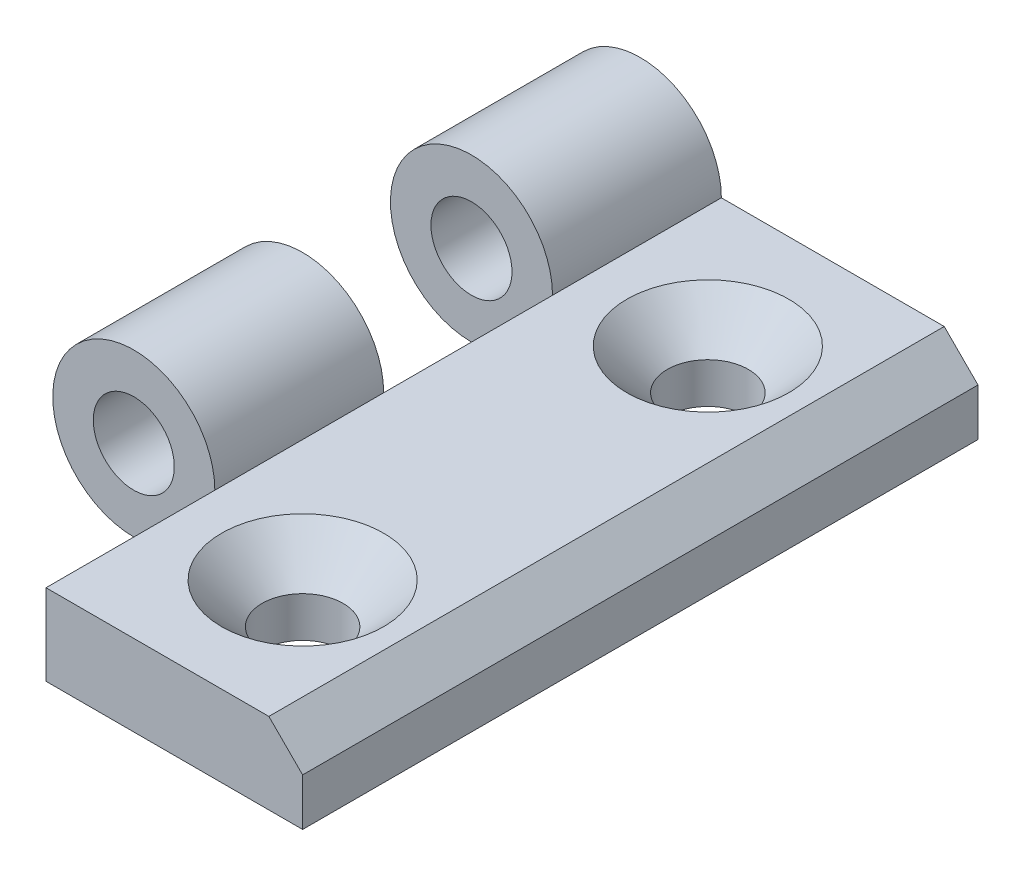
ISO-10303-21;
HEADER;
FILE_DESCRIPTION(('STEP AP214'),'2;1');
FILE_NAME('part.step','',(''),(''),'','','');
FILE_SCHEMA(('AUTOMOTIVE_DESIGN { 1 0 10303 214 1 1 1 1 }'));
ENDSEC;
DATA;
#1=APPLICATION_CONTEXT('core data for automotive mechanical design processes');
#2=APPLICATION_PROTOCOL_DEFINITION('international standard','automotive_design',2000,#1);
#3=PRODUCT_CONTEXT('',#1,'mechanical');
#4=PRODUCT('Part','Part','',(#3));
#5=PRODUCT_RELATED_PRODUCT_CATEGORY('part','',(#4));
#6=PRODUCT_DEFINITION_FORMATION('','',#4);
#7=PRODUCT_DEFINITION_CONTEXT('part definition',#1,'design');
#8=PRODUCT_DEFINITION('design','',#6,#7);
#9=PRODUCT_DEFINITION_SHAPE('','',#8);
#10=(LENGTH_UNIT() NAMED_UNIT(*) SI_UNIT(.MILLI.,.METRE.));
#11=(NAMED_UNIT(*) PLANE_ANGLE_UNIT() SI_UNIT($,.RADIAN.));
#12=(NAMED_UNIT(*) SI_UNIT($,.STERADIAN.) SOLID_ANGLE_UNIT());
#13=UNCERTAINTY_MEASURE_WITH_UNIT(LENGTH_MEASURE(1.E-05),#10,'distance_accuracy_value','');
#14=(GEOMETRIC_REPRESENTATION_CONTEXT(3) GLOBAL_UNCERTAINTY_ASSIGNED_CONTEXT((#13)) GLOBAL_UNIT_ASSIGNED_CONTEXT((#10,
#11,#12)) REPRESENTATION_CONTEXT('',''));
#15=CARTESIAN_POINT('',(0.,0.,0.));
#16=DIRECTION('',(0.,0.,1.));
#17=DIRECTION('',(1.,0.,0.));
#18=AXIS2_PLACEMENT_3D('',#15,#16,#17);
#19=CARTESIAN_POINT('',(-36.9996963445374,47.3325537523692,50.));
#20=DIRECTION('',(0.,0.,-1.));
#21=DIRECTION('',(-1.,0.,0.));
#22=AXIS2_PLACEMENT_3D('',#19,#20,#21);
#23=CYLINDRICAL_SURFACE('',#22,6.);
#24=CARTESIAN_POINT('',(-36.9996963445374,47.3325537523692,25.));
#25=DIRECTION('',(0.,0.,-1.));
#26=DIRECTION('',(-1.,0.,0.));
#27=AXIS2_PLACEMENT_3D('',#24,#25,#26);
#28=CIRCLE('',#27,6.);
#29=CARTESIAN_POINT('',(-36.9996963445374,41.3325537523692,25.));
#30=VERTEX_POINT('',#29);
#31=CARTESIAN_POINT('',(-30.9996963445374,47.3325537523692,25.));
#32=VERTEX_POINT('',#31);
#33=EDGE_CURVE('E108',#30,#32,#28,.T.);
#34=ORIENTED_EDGE('',*,*,#33,.F.);
#35=DIRECTION('',(0.,0.,1.));
#36=VECTOR('',#35,1.);
#37=CARTESIAN_POINT('',(-36.9996963445374,41.3325537523692,0.));
#38=LINE('',#37,#36);
#39=CARTESIAN_POINT('',(-36.9996963445374,41.3325537523692,37.5));
#40=VERTEX_POINT('',#39);
#41=EDGE_CURVE('E195',#30,#40,#38,.T.);
#42=ORIENTED_EDGE('',*,*,#41,.T.);
#43=CARTESIAN_POINT('',(-36.9996963445374,47.3325537523692,37.5));
#44=DIRECTION('',(0.,0.,-1.));
#45=DIRECTION('',(-1.,0.,0.));
#46=AXIS2_PLACEMENT_3D('',#43,#44,#45);
#47=CIRCLE('',#46,6.);
#48=CARTESIAN_POINT('',(-30.9996963445374,47.3325537523692,37.5));
#49=VERTEX_POINT('',#48);
#50=EDGE_CURVE('E142',#40,#49,#47,.T.);
#51=ORIENTED_EDGE('',*,*,#50,.T.);
#52=DIRECTION('',(0.,0.,-1.));
#53=VECTOR('',#52,1.);
#54=CARTESIAN_POINT('',(-30.9996963445374,47.3325537523692,50.));
#55=LINE('',#54,#53);
#56=EDGE_CURVE('E134',#49,#32,#55,.T.);
#57=ORIENTED_EDGE('',*,*,#56,.T.);
#58=EDGE_LOOP('',(#34,#42,#51,#57));
#59=FACE_BOUND('',#58,.T.);
#60=ADVANCED_FACE('F37',(#59),#23,.T.);
#61=CARTESIAN_POINT('',(-36.9996963445374,47.3325537523692,0.));
#62=DIRECTION('',(0.,0.,1.));
#63=DIRECTION('',(1.,0.,0.));
#64=AXIS2_PLACEMENT_3D('',#61,#62,#63);
#65=CYLINDRICAL_SURFACE('',#64,3.);
#66=CARTESIAN_POINT('',(-36.9996963445374,47.3325537523692,37.5));
#67=DIRECTION('',(0.,0.,-1.));
#68=DIRECTION('',(-1.,0.,0.));
#69=AXIS2_PLACEMENT_3D('',#66,#67,#68);
#70=CIRCLE('',#69,3.);
#71=CARTESIAN_POINT('',(-39.9996963445374,47.3325537523692,37.5));
#72=VERTEX_POINT('',#71);
#73=EDGE_CURVE('E154',#72,#72,#70,.F.);
#74=ORIENTED_EDGE('',*,*,#73,.T.);
#75=EDGE_LOOP('',(#74));
#76=FACE_BOUND('',#75,.T.);
#77=CARTESIAN_POINT('',(-36.9996963445374,47.3325537523692,25.));
#78=DIRECTION('',(0.,0.,-1.));
#79=DIRECTION('',(-1.,0.,0.));
#80=AXIS2_PLACEMENT_3D('',#77,#78,#79);
#81=CIRCLE('',#80,3.);
#82=CARTESIAN_POINT('',(-39.9996963445374,47.3325537523692,25.));
#83=VERTEX_POINT('',#82);
#84=EDGE_CURVE('E160',#83,#83,#81,.F.);
#85=ORIENTED_EDGE('',*,*,#84,.F.);
#86=EDGE_LOOP('',(#85));
#87=FACE_BOUND('',#86,.T.);
#88=ADVANCED_FACE('F256',(#76,#87),#65,.F.);
#89=CARTESIAN_POINT('',(-36.9996963445374,41.3325537523692,0.));
#90=VERTEX_POINT('',#89);
#91=CARTESIAN_POINT('',(-36.9996963445374,41.3325537523692,12.5));
#92=VERTEX_POINT('',#91);
#93=EDGE_CURVE('E149',#90,#92,#38,.T.);
#94=ORIENTED_EDGE('',*,*,#93,.T.);
#95=CARTESIAN_POINT('',(-36.9996963445374,47.3325537523692,12.5));
#96=DIRECTION('',(0.,0.,-1.));
#97=DIRECTION('',(-1.,0.,0.));
#98=AXIS2_PLACEMENT_3D('',#95,#96,#97);
#99=CIRCLE('',#98,6.);
#100=CARTESIAN_POINT('',(-30.9996963445374,47.3325537523692,12.5));
#101=VERTEX_POINT('',#100);
#102=EDGE_CURVE('E138',#92,#101,#99,.T.);
#103=ORIENTED_EDGE('',*,*,#102,.T.);
#104=CARTESIAN_POINT('',(-30.9996963445374,47.3325537523692,0.));
#105=VERTEX_POINT('',#104);
#106=EDGE_CURVE('E136',#101,#105,#55,.T.);
#107=ORIENTED_EDGE('',*,*,#106,.T.);
#108=CARTESIAN_POINT('',(-36.9996963445374,47.3325537523692,0.));
#109=DIRECTION('',(0.,0.,1.));
#110=DIRECTION('',(1.,0.,0.));
#111=AXIS2_PLACEMENT_3D('',#108,#109,#110);
#112=CIRCLE('',#111,6.);
#113=EDGE_CURVE('E145',#105,#90,#112,.T.);
#114=ORIENTED_EDGE('',*,*,#113,.T.);
#115=EDGE_LOOP('',(#94,#103,#107,#114));
#116=FACE_BOUND('',#115,.T.);
#117=ADVANCED_FACE('F236',(#116),#23,.T.);
#118=CARTESIAN_POINT('',(-36.9996963445374,47.3325537523692,50.));
#119=DIRECTION('',(0.,0.,1.));
#120=DIRECTION('',(1.,0.,0.));
#121=AXIS2_PLACEMENT_3D('',#118,#119,#120);
#122=PLANE('',#121);
#123=DIRECTION('',(0.,1.,0.));
#124=VECTOR('',#123,1.);
#125=CARTESIAN_POINT('',(-11.9996963445374,47.3325537523692,50.));
#126=LINE('',#125,#124);
#127=CARTESIAN_POINT('',(-11.9996963445374,41.3325537523692,50.));
#128=VERTEX_POINT('',#127);
#129=CARTESIAN_POINT('',(-11.9996963445374,44.8325537523692,50.));
#130=VERTEX_POINT('',#129);
#131=EDGE_CURVE('E175',#128,#130,#126,.T.);
#132=ORIENTED_EDGE('',*,*,#131,.T.);
#133=DIRECTION('',(0.707106781186549,-0.707106781186546,0.));
#134=VECTOR('',#133,1.);
#135=CARTESIAN_POINT('',(-25.7496963445374,58.5825537523692,50.));
#136=LINE('',#135,#134);
#137=CARTESIAN_POINT('',(-14.4996963445374,47.3325537523692,50.));
#138=VERTEX_POINT('',#137);
#139=EDGE_CURVE('E59',#130,#138,#136,.F.);
#140=ORIENTED_EDGE('',*,*,#139,.T.);
#141=DIRECTION('',(-1.,0.,0.));
#142=VECTOR('',#141,1.);
#143=CARTESIAN_POINT('',(-36.9996963445374,47.3325537523692,50.));
#144=LINE('',#143,#142);
#145=CARTESIAN_POINT('',(-30.9996963445374,47.3325537523692,50.));
#146=VERTEX_POINT('',#145);
#147=EDGE_CURVE('E189',#138,#146,#144,.T.);
#148=ORIENTED_EDGE('',*,*,#147,.T.);
#149=DIRECTION('',(0.,1.,0.));
#150=VECTOR('',#149,1.);
#151=CARTESIAN_POINT('',(-30.9996963445374,47.3325537523692,50.));
#152=LINE('',#151,#150);
#153=CARTESIAN_POINT('',(-30.9996963445374,41.3325537523692,50.));
#154=VERTEX_POINT('',#153);
#155=EDGE_CURVE('E137',#154,#146,#152,.T.);
#156=ORIENTED_EDGE('',*,*,#155,.F.);
#157=DIRECTION('',(1.,0.,0.));
#158=VECTOR('',#157,1.);
#159=CARTESIAN_POINT('',(-36.9996963445374,41.3325537523692,50.));
#160=LINE('',#159,#158);
#161=EDGE_CURVE('E183',#154,#128,#160,.T.);
#162=ORIENTED_EDGE('',*,*,#161,.T.);
#163=EDGE_LOOP('',(#132,#140,#148,#156,#162));
#164=FACE_BOUND('',#163,.T.);
#165=ADVANCED_FACE('F180',(#164),#122,.T.);
#166=CARTESIAN_POINT('',(-36.9996963445374,47.3325537523692,0.));
#167=DIRECTION('',(0.,0.,1.));
#168=DIRECTION('',(1.,0.,0.));
#169=AXIS2_PLACEMENT_3D('',#166,#167,#168);
#170=PLANE('',#169);
#171=CARTESIAN_POINT('',(-36.9996963445374,47.3325537523692,0.));
#172=DIRECTION('',(0.,0.,1.));
#173=DIRECTION('',(1.,0.,0.));
#174=AXIS2_PLACEMENT_3D('',#171,#172,#173);
#175=CIRCLE('',#174,3.);
#176=CARTESIAN_POINT('',(-33.9996963445374,47.3325537523692,0.));
#177=VERTEX_POINT('',#176);
#178=EDGE_CURVE('E200',#177,#177,#175,.T.);
#179=ORIENTED_EDGE('',*,*,#178,.T.);
#180=EDGE_LOOP('',(#179));
#181=FACE_BOUND('',#180,.T.);
#182=DIRECTION('',(-1.,0.,0.));
#183=VECTOR('',#182,1.);
#184=CARTESIAN_POINT('',(-36.9996963445374,47.3325537523692,0.));
#185=LINE('',#184,#183);
#186=CARTESIAN_POINT('',(-14.4996963445374,47.3325537523692,0.));
#187=VERTEX_POINT('',#186);
#188=EDGE_CURVE('E185',#187,#105,#185,.T.);
#189=ORIENTED_EDGE('',*,*,#188,.F.);
#190=DIRECTION('',(-0.707106781186549,0.707106781186546,0.));
#191=VECTOR('',#190,1.);
#192=CARTESIAN_POINT('',(-11.9996963445374,44.8325537523692,0.));
#193=LINE('',#192,#191);
#194=CARTESIAN_POINT('',(-11.9996963445374,44.8325537523692,0.));
#195=VERTEX_POINT('',#194);
#196=EDGE_CURVE('E11',#187,#195,#193,.F.);
#197=ORIENTED_EDGE('',*,*,#196,.T.);
#198=DIRECTION('',(0.,1.,0.));
#199=VECTOR('',#198,1.);
#200=CARTESIAN_POINT('',(-11.9996963445374,47.3325537523692,0.));
#201=LINE('',#200,#199);
#202=CARTESIAN_POINT('',(-11.9996963445374,41.3325537523692,0.));
#203=VERTEX_POINT('',#202);
#204=EDGE_CURVE('E177',#203,#195,#201,.T.);
#205=ORIENTED_EDGE('',*,*,#204,.F.);
#206=DIRECTION('',(1.,0.,0.));
#207=VECTOR('',#206,1.);
#208=CARTESIAN_POINT('',(-36.9996963445374,41.3325537523692,0.));
#209=LINE('',#208,#207);
#210=EDGE_CURVE('E187',#90,#203,#209,.T.);
#211=ORIENTED_EDGE('',*,*,#210,.F.);
#212=ORIENTED_EDGE('',*,*,#113,.F.);
#213=EDGE_LOOP('',(#189,#197,#205,#211,#212));
#214=FACE_BOUND('',#213,.T.);
#215=ADVANCED_FACE('F240',(#181,#214),#170,.F.);
#216=CARTESIAN_POINT('',(-36.9996963445374,47.3325537523692,0.));
#217=DIRECTION('',(0.,1.,0.));
#218=DIRECTION('',(0.,0.,1.));
#219=AXIS2_PLACEMENT_3D('',#216,#217,#218);
#220=PLANE('',#219);
#221=CARTESIAN_POINT('',(-21.9996963445374,47.3325537523692,40.));
#222=DIRECTION('',(0.,1.,0.));
#223=DIRECTION('',(0.,0.,1.));
#224=AXIS2_PLACEMENT_3D('',#221,#222,#223);
#225=CIRCLE('',#224,6.);
#226=CARTESIAN_POINT('',(-21.9996963445374,47.3325537523692,46.));
#227=VERTEX_POINT('',#226);
#228=EDGE_CURVE('E222',#227,#227,#225,.T.);
#229=ORIENTED_EDGE('',*,*,#228,.F.);
#230=EDGE_LOOP('',(#229));
#231=FACE_BOUND('',#230,.T.);
#232=CARTESIAN_POINT('',(-21.9996963445374,47.3325537523692,10.));
#233=DIRECTION('',(0.,1.,0.));
#234=DIRECTION('',(0.,0.,1.));
#235=AXIS2_PLACEMENT_3D('',#232,#233,#234);
#236=CIRCLE('',#235,6.);
#237=CARTESIAN_POINT('',(-21.9996963445374,47.3325537523692,16.));
#238=VERTEX_POINT('',#237);
#239=EDGE_CURVE('E213',#238,#238,#236,.T.);
#240=ORIENTED_EDGE('',*,*,#239,.F.);
#241=EDGE_LOOP('',(#240));
#242=FACE_BOUND('',#241,.T.);
#243=ORIENTED_EDGE('',*,*,#147,.F.);
#244=DIRECTION('',(0.,0.,-1.));
#245=VECTOR('',#244,1.);
#246=CARTESIAN_POINT('',(-14.4996963445374,47.3325537523692,0.));
#247=LINE('',#246,#245);
#248=EDGE_CURVE('E45',#138,#187,#247,.T.);
#249=ORIENTED_EDGE('',*,*,#248,.T.);
#250=ORIENTED_EDGE('',*,*,#188,.T.);
#251=ORIENTED_EDGE('',*,*,#106,.F.);
#252=DIRECTION('',(0.,0.,-1.));
#253=VECTOR('',#252,1.);
#254=CARTESIAN_POINT('',(-30.9996963445374,47.3325537523692,0.));
#255=LINE('',#254,#253);
#256=EDGE_CURVE('E124',#32,#101,#255,.T.);
#257=ORIENTED_EDGE('',*,*,#256,.F.);
#258=ORIENTED_EDGE('',*,*,#56,.F.);
#259=EDGE_CURVE('E143',#146,#49,#55,.T.);
#260=ORIENTED_EDGE('',*,*,#259,.F.);
#261=EDGE_LOOP('',(#243,#249,#250,#251,#257,#258,#260));
#262=FACE_BOUND('',#261,.T.);
#263=ADVANCED_FACE('F132',(#231,#242,#262),#220,.T.);
#264=CARTESIAN_POINT('',(-11.9996963445374,47.3325537523692,0.));
#265=DIRECTION('',(1.,0.,0.));
#266=DIRECTION('',(0.,0.,-1.));
#267=AXIS2_PLACEMENT_3D('',#264,#265,#266);
#268=PLANE('',#267);
#269=ORIENTED_EDGE('',*,*,#204,.T.);
#270=DIRECTION('',(0.,0.,1.));
#271=VECTOR('',#270,1.);
#272=CARTESIAN_POINT('',(-11.9996963445374,44.8325537523692,0.));
#273=LINE('',#272,#271);
#274=EDGE_CURVE('E167',#195,#130,#273,.T.);
#275=ORIENTED_EDGE('',*,*,#274,.T.);
#276=ORIENTED_EDGE('',*,*,#131,.F.);
#277=DIRECTION('',(0.,0.,1.));
#278=VECTOR('',#277,1.);
#279=CARTESIAN_POINT('',(-11.9996963445374,41.3325537523692,0.));
#280=LINE('',#279,#278);
#281=EDGE_CURVE('E146',#203,#128,#280,.T.);
#282=ORIENTED_EDGE('',*,*,#281,.F.);
#283=EDGE_LOOP('',(#269,#275,#276,#282));
#284=FACE_BOUND('',#283,.T.);
#285=ADVANCED_FACE('F174',(#284),#268,.T.);
#286=CARTESIAN_POINT('',(-36.9996963445374,41.3325537523692,0.));
#287=DIRECTION('',(0.,-1.,0.));
#288=DIRECTION('',(0.,0.,-1.));
#289=AXIS2_PLACEMENT_3D('',#286,#287,#288);
#290=PLANE('',#289);
#291=DIRECTION('',(1.,0.,0.));
#292=VECTOR('',#291,1.);
#293=CARTESIAN_POINT('',(-36.9996963445374,41.3325537523692,12.5));
#294=LINE('',#293,#292);
#295=CARTESIAN_POINT('',(-30.9996963445374,41.3325537523692,12.5));
#296=VERTEX_POINT('',#295);
#297=EDGE_CURVE('E165',#92,#296,#294,.T.);
#298=ORIENTED_EDGE('',*,*,#297,.F.);
#299=ORIENTED_EDGE('',*,*,#93,.F.);
#300=ORIENTED_EDGE('',*,*,#210,.T.);
#301=ORIENTED_EDGE('',*,*,#281,.T.);
#302=ORIENTED_EDGE('',*,*,#161,.F.);
#303=DIRECTION('',(0.,0.,1.));
#304=VECTOR('',#303,1.);
#305=CARTESIAN_POINT('',(-30.9996963445374,41.3325537523692,0.));
#306=LINE('',#305,#304);
#307=CARTESIAN_POINT('',(-30.9996963445374,41.3325537523692,37.5));
#308=VERTEX_POINT('',#307);
#309=EDGE_CURVE('E153',#308,#154,#306,.T.);
#310=ORIENTED_EDGE('',*,*,#309,.F.);
#311=DIRECTION('',(1.,0.,0.));
#312=VECTOR('',#311,1.);
#313=CARTESIAN_POINT('',(-36.9996963445374,41.3325537523692,37.5));
#314=LINE('',#313,#312);
#315=EDGE_CURVE('E157',#40,#308,#314,.T.);
#316=ORIENTED_EDGE('',*,*,#315,.F.);
#317=ORIENTED_EDGE('',*,*,#41,.F.);
#318=DIRECTION('',(1.,0.,0.));
#319=VECTOR('',#318,1.);
#320=CARTESIAN_POINT('',(-36.9996963445374,41.3325537523692,25.));
#321=LINE('',#320,#319);
#322=CARTESIAN_POINT('',(-30.9996963445374,41.3325537523692,25.));
#323=VERTEX_POINT('',#322);
#324=EDGE_CURVE('E114',#30,#323,#321,.T.);
#325=ORIENTED_EDGE('',*,*,#324,.T.);
#326=DIRECTION('',(0.,0.,1.));
#327=VECTOR('',#326,1.);
#328=CARTESIAN_POINT('',(-30.9996963445374,41.3325537523692,0.));
#329=LINE('',#328,#327);
#330=EDGE_CURVE('E127',#296,#323,#329,.T.);
#331=ORIENTED_EDGE('',*,*,#330,.F.);
#332=EDGE_LOOP('',(#298,#299,#300,#301,#302,#310,#316,#317,#325,#331));
#333=FACE_BOUND('',#332,.T.);
#334=CARTESIAN_POINT('',(-21.9996963445374,41.3325537523692,40.));
#335=DIRECTION('',(0.,1.,0.));
#336=DIRECTION('',(0.,0.,1.));
#337=AXIS2_PLACEMENT_3D('',#334,#335,#336);
#338=CIRCLE('',#337,3.);
#339=CARTESIAN_POINT('',(-21.9996963445374,41.3325537523692,43.));
#340=VERTEX_POINT('',#339);
#341=EDGE_CURVE('E216',#340,#340,#338,.T.);
#342=ORIENTED_EDGE('',*,*,#341,.T.);
#343=EDGE_LOOP('',(#342));
#344=FACE_BOUND('',#343,.T.);
#345=CARTESIAN_POINT('',(-21.9996963445374,41.3325537523692,10.));
#346=DIRECTION('',(0.,1.,0.));
#347=DIRECTION('',(0.,0.,1.));
#348=AXIS2_PLACEMENT_3D('',#345,#346,#347);
#349=CIRCLE('',#348,3.);
#350=CARTESIAN_POINT('',(-21.9996963445374,41.3325537523692,13.));
#351=VERTEX_POINT('',#350);
#352=EDGE_CURVE('E203',#351,#351,#349,.T.);
#353=ORIENTED_EDGE('',*,*,#352,.T.);
#354=EDGE_LOOP('',(#353));
#355=FACE_BOUND('',#354,.T.);
#356=ADVANCED_FACE('F241',(#333,#344,#355),#290,.T.);
#357=CARTESIAN_POINT('',(-36.9996963445374,47.3325537523692,12.5));
#358=DIRECTION('',(0.,0.,-1.));
#359=DIRECTION('',(-1.,0.,0.));
#360=AXIS2_PLACEMENT_3D('',#357,#358,#359);
#361=CIRCLE('',#360,3.);
#362=CARTESIAN_POINT('',(-39.9996963445374,47.3325537523692,12.5));
#363=VERTEX_POINT('',#362);
#364=EDGE_CURVE('E118',#363,#363,#361,.F.);
#365=ORIENTED_EDGE('',*,*,#364,.T.);
#366=EDGE_LOOP('',(#365));
#367=FACE_BOUND('',#366,.T.);
#368=ORIENTED_EDGE('',*,*,#178,.F.);
#369=EDGE_LOOP('',(#368));
#370=FACE_BOUND('',#369,.T.);
#371=ADVANCED_FACE('F262',(#367,#370),#65,.F.);
#372=CARTESIAN_POINT('',(-21.9996963445374,47.3325537523692,10.));
#373=DIRECTION('',(0.,1.,0.));
#374=DIRECTION('',(0.,0.,1.));
#375=AXIS2_PLACEMENT_3D('',#372,#373,#374);
#376=CYLINDRICAL_SURFACE('',#375,3.);
#377=ORIENTED_EDGE('',*,*,#352,.F.);
#378=EDGE_LOOP('',(#377));
#379=FACE_BOUND('',#378,.T.);
#380=CARTESIAN_POINT('',(-21.9996963445374,44.3325537523692,10.));
#381=DIRECTION('',(0.,1.,0.));
#382=DIRECTION('',(0.,0.,1.));
#383=AXIS2_PLACEMENT_3D('',#380,#381,#382);
#384=CIRCLE('',#383,3.);
#385=CARTESIAN_POINT('',(-21.9996963445374,44.3325537523692,13.));
#386=VERTEX_POINT('',#385);
#387=EDGE_CURVE('E208',#386,#386,#384,.T.);
#388=ORIENTED_EDGE('',*,*,#387,.T.);
#389=EDGE_LOOP('',(#388));
#390=FACE_BOUND('',#389,.T.);
#391=ADVANCED_FACE('F281',(#379,#390),#376,.F.);
#392=CARTESIAN_POINT('',(-21.9996963445374,47.3325537523692,10.));
#393=DIRECTION('',(0.,1.,0.));
#394=DIRECTION('',(0.,0.,1.));
#395=AXIS2_PLACEMENT_3D('',#392,#393,#394);
#396=CONICAL_SURFACE('',#395,6.,0.78539816339745);
#397=ORIENTED_EDGE('',*,*,#387,.F.);
#398=EDGE_LOOP('',(#397));
#399=FACE_BOUND('',#398,.T.);
#400=ORIENTED_EDGE('',*,*,#239,.T.);
#401=EDGE_LOOP('',(#400));
#402=FACE_BOUND('',#401,.T.);
#403=ADVANCED_FACE('F285',(#399,#402),#396,.F.);
#404=CARTESIAN_POINT('',(-21.9996963445374,47.3325537523692,40.));
#405=DIRECTION('',(0.,1.,0.));
#406=DIRECTION('',(0.,0.,1.));
#407=AXIS2_PLACEMENT_3D('',#404,#405,#406);
#408=CYLINDRICAL_SURFACE('',#407,3.);
#409=ORIENTED_EDGE('',*,*,#341,.F.);
#410=EDGE_LOOP('',(#409));
#411=FACE_BOUND('',#410,.T.);
#412=CARTESIAN_POINT('',(-21.9996963445374,44.3325537523692,40.));
#413=DIRECTION('',(0.,1.,0.));
#414=DIRECTION('',(0.,0.,1.));
#415=AXIS2_PLACEMENT_3D('',#412,#413,#414);
#416=CIRCLE('',#415,3.);
#417=CARTESIAN_POINT('',(-21.9996963445374,44.3325537523692,43.));
#418=VERTEX_POINT('',#417);
#419=EDGE_CURVE('E219',#418,#418,#416,.T.);
#420=ORIENTED_EDGE('',*,*,#419,.T.);
#421=EDGE_LOOP('',(#420));
#422=FACE_BOUND('',#421,.T.);
#423=ADVANCED_FACE('F289',(#411,#422),#408,.F.);
#424=CARTESIAN_POINT('',(-21.9996963445374,47.3325537523692,40.));
#425=DIRECTION('',(0.,1.,0.));
#426=DIRECTION('',(0.,0.,1.));
#427=AXIS2_PLACEMENT_3D('',#424,#425,#426);
#428=CONICAL_SURFACE('',#427,6.,0.785398163397449);
#429=ORIENTED_EDGE('',*,*,#419,.F.);
#430=EDGE_LOOP('',(#429));
#431=FACE_BOUND('',#430,.T.);
#432=ORIENTED_EDGE('',*,*,#228,.T.);
#433=EDGE_LOOP('',(#432));
#434=FACE_BOUND('',#433,.T.);
#435=ADVANCED_FACE('F293',(#431,#434),#428,.F.);
#436=CARTESIAN_POINT('',(0.,0.,37.5));
#437=DIRECTION('',(0.,0.,-1.));
#438=DIRECTION('',(-1.,0.,0.));
#439=AXIS2_PLACEMENT_3D('',#436,#437,#438);
#440=PLANE('',#439);
#441=ORIENTED_EDGE('',*,*,#73,.F.);
#442=EDGE_LOOP('',(#441));
#443=FACE_BOUND('',#442,.T.);
#444=ORIENTED_EDGE('',*,*,#315,.T.);
#445=DIRECTION('',(0.,1.,0.));
#446=VECTOR('',#445,1.);
#447=CARTESIAN_POINT('',(-30.9996963445374,53.9091091307,37.5));
#448=LINE('',#447,#446);
#449=EDGE_CURVE('E158',#308,#49,#448,.T.);
#450=ORIENTED_EDGE('',*,*,#449,.T.);
#451=ORIENTED_EDGE('',*,*,#50,.F.);
#452=EDGE_LOOP('',(#444,#450,#451));
#453=FACE_BOUND('',#452,.T.);
#454=ADVANCED_FACE('F247',(#443,#453),#440,.F.);
#455=CARTESIAN_POINT('',(-30.9996963445374,47.3325537523692,37.5));
#456=DIRECTION('',(1.,0.,0.));
#457=DIRECTION('',(0.,0.,-1.));
#458=AXIS2_PLACEMENT_3D('',#455,#456,#457);
#459=PLANE('',#458);
#460=ORIENTED_EDGE('',*,*,#259,.T.);
#461=ORIENTED_EDGE('',*,*,#449,.F.);
#462=ORIENTED_EDGE('',*,*,#309,.T.);
#463=ORIENTED_EDGE('',*,*,#155,.T.);
#464=EDGE_LOOP('',(#460,#461,#462,#463));
#465=FACE_BOUND('',#464,.T.);
#466=ADVANCED_FACE('F249',(#465),#459,.F.);
#467=CARTESIAN_POINT('',(0.,0.,12.5));
#468=DIRECTION('',(0.,0.,-1.));
#469=DIRECTION('',(-1.,0.,0.));
#470=AXIS2_PLACEMENT_3D('',#467,#468,#469);
#471=PLANE('',#470);
#472=ORIENTED_EDGE('',*,*,#364,.F.);
#473=EDGE_LOOP('',(#472));
#474=FACE_BOUND('',#473,.T.);
#475=ORIENTED_EDGE('',*,*,#297,.T.);
#476=DIRECTION('',(0.,1.,0.));
#477=VECTOR('',#476,1.);
#478=CARTESIAN_POINT('',(-30.9996963445374,53.9091091307,12.5));
#479=LINE('',#478,#477);
#480=EDGE_CURVE('E128',#296,#101,#479,.T.);
#481=ORIENTED_EDGE('',*,*,#480,.T.);
#482=ORIENTED_EDGE('',*,*,#102,.F.);
#483=EDGE_LOOP('',(#475,#481,#482));
#484=FACE_BOUND('',#483,.T.);
#485=ADVANCED_FACE('F234',(#474,#484),#471,.F.);
#486=CARTESIAN_POINT('',(0.,0.,25.));
#487=DIRECTION('',(0.,0.,-1.));
#488=DIRECTION('',(-1.,0.,0.));
#489=AXIS2_PLACEMENT_3D('',#486,#487,#488);
#490=PLANE('',#489);
#491=ORIENTED_EDGE('',*,*,#84,.T.);
#492=EDGE_LOOP('',(#491));
#493=FACE_BOUND('',#492,.T.);
#494=ORIENTED_EDGE('',*,*,#33,.T.);
#495=DIRECTION('',(0.,1.,0.));
#496=VECTOR('',#495,1.);
#497=CARTESIAN_POINT('',(-30.9996963445374,47.3325537523692,25.));
#498=LINE('',#497,#496);
#499=EDGE_CURVE('E111',#323,#32,#498,.T.);
#500=ORIENTED_EDGE('',*,*,#499,.F.);
#501=ORIENTED_EDGE('',*,*,#324,.F.);
#502=EDGE_LOOP('',(#494,#500,#501));
#503=FACE_BOUND('',#502,.T.);
#504=ADVANCED_FACE('F110',(#493,#503),#490,.T.);
#505=CARTESIAN_POINT('',(-30.9996963445374,47.3325537523692,12.5));
#506=DIRECTION('',(1.,0.,0.));
#507=DIRECTION('',(0.,0.,-1.));
#508=AXIS2_PLACEMENT_3D('',#505,#506,#507);
#509=PLANE('',#508);
#510=ORIENTED_EDGE('',*,*,#256,.T.);
#511=ORIENTED_EDGE('',*,*,#480,.F.);
#512=ORIENTED_EDGE('',*,*,#330,.T.);
#513=ORIENTED_EDGE('',*,*,#499,.T.);
#514=EDGE_LOOP('',(#510,#511,#512,#513));
#515=FACE_BOUND('',#514,.T.);
#516=ADVANCED_FACE('F122',(#515),#509,.F.);
#517=CARTESIAN_POINT('',(-11.9996963445374,44.8325537523692,0.));
#518=DIRECTION('',(-0.707106781186545,-0.707106781186549,0.));
#519=DIRECTION('',(0.,0.,1.));
#520=AXIS2_PLACEMENT_3D('',#517,#518,#519);
#521=PLANE('',#520);
#522=ORIENTED_EDGE('',*,*,#196,.F.);
#523=ORIENTED_EDGE('',*,*,#248,.F.);
#524=ORIENTED_EDGE('',*,*,#139,.F.);
#525=ORIENTED_EDGE('',*,*,#274,.F.);
#526=EDGE_LOOP('',(#522,#523,#524,#525));
#527=FACE_BOUND('',#526,.T.);
#528=ADVANCED_FACE('F39',(#527),#521,.F.);
#529=CLOSED_SHELL('',(#60,#88,#117,#165,#215,#263,#285,#356,#371,#391,#403,#423,#435,#454,#466,
#485,#504,#516,#528));
#530=MANIFOLD_SOLID_BREP('B2',#529);
#531=ADVANCED_BREP_SHAPE_REPRESENTATION('',(#18,#530),#14);
#532=SHAPE_DEFINITION_REPRESENTATION(#9,#531);
ENDSEC;
END-ISO-10303-21;
